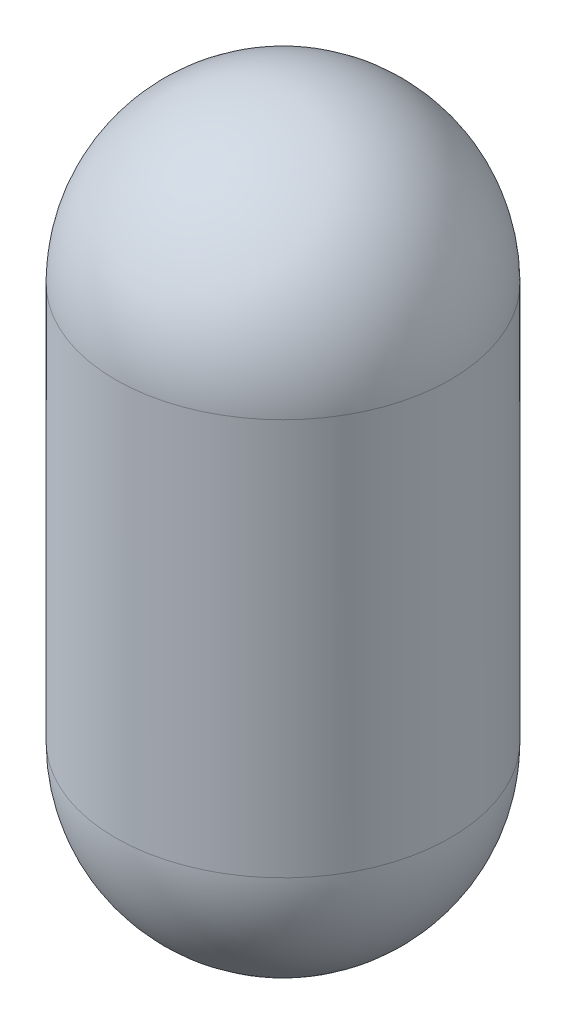
ISO-10303-21;
HEADER;
FILE_DESCRIPTION(('STEP AP214'),'2;1');
FILE_NAME('part.step','',(''),(''),'','','');
FILE_SCHEMA(('AUTOMOTIVE_DESIGN { 1 0 10303 214 1 1 1 1 }'));
ENDSEC;
DATA;
#1=APPLICATION_CONTEXT('core data for automotive mechanical design processes');
#2=APPLICATION_PROTOCOL_DEFINITION('international standard','automotive_design',2000,#1);
#3=PRODUCT_CONTEXT('',#1,'mechanical');
#4=PRODUCT('Part','Part','',(#3));
#5=PRODUCT_RELATED_PRODUCT_CATEGORY('part','',(#4));
#6=PRODUCT_DEFINITION_FORMATION('','',#4);
#7=PRODUCT_DEFINITION_CONTEXT('part definition',#1,'design');
#8=PRODUCT_DEFINITION('design','',#6,#7);
#9=PRODUCT_DEFINITION_SHAPE('','',#8);
#10=(LENGTH_UNIT() NAMED_UNIT(*) SI_UNIT(.MILLI.,.METRE.));
#11=(NAMED_UNIT(*) PLANE_ANGLE_UNIT() SI_UNIT($,.RADIAN.));
#12=(NAMED_UNIT(*) SI_UNIT($,.STERADIAN.) SOLID_ANGLE_UNIT());
#13=UNCERTAINTY_MEASURE_WITH_UNIT(LENGTH_MEASURE(1.E-05),#10,'distance_accuracy_value','');
#14=(GEOMETRIC_REPRESENTATION_CONTEXT(3) GLOBAL_UNCERTAINTY_ASSIGNED_CONTEXT((#13)) GLOBAL_UNIT_ASSIGNED_CONTEXT((#10,
#11,#12)) REPRESENTATION_CONTEXT('',''));
#15=CARTESIAN_POINT('',(0.,0.,0.));
#16=DIRECTION('',(0.,0.,1.));
#17=DIRECTION('',(1.,0.,0.));
#18=AXIS2_PLACEMENT_3D('',#15,#16,#17);
#19=CARTESIAN_POINT('',(0.,87.9475,0.));
#20=DIRECTION('',(0.,1.,0.));
#21=DIRECTION('',(1.,0.,0.));
#22=AXIS2_PLACEMENT_3D('',#19,#20,#21);
#23=SPHERICAL_SURFACE('',#22,74.295);
#24=CARTESIAN_POINT('',(0.,87.9475,0.));
#25=DIRECTION('',(0.,1.,0.));
#26=DIRECTION('',(0.,0.,1.));
#27=AXIS2_PLACEMENT_3D('',#24,#25,#26);
#28=CIRCLE('',#27,74.295);
#29=CARTESIAN_POINT('',(0.,87.9475,74.295));
#30=VERTEX_POINT('',#29);
#31=EDGE_CURVE('E10',#30,#30,#28,.T.);
#32=ORIENTED_EDGE('',*,*,#31,.T.);
#33=EDGE_LOOP('',(#32));
#34=FACE_BOUND('',#33,.T.);
#35=ADVANCED_FACE('F38',(#34),#23,.T.);
#36=CARTESIAN_POINT('',(0.,87.9475,0.));
#37=DIRECTION('',(0.,1.,0.));
#38=DIRECTION('',(0.,0.,1.));
#39=AXIS2_PLACEMENT_3D('',#36,#37,#38);
#40=CYLINDRICAL_SURFACE('',#39,74.295);
#41=CARTESIAN_POINT('',(0.,-87.9475,0.));
#42=DIRECTION('',(0.,1.,0.));
#43=DIRECTION('',(0.,0.,1.));
#44=AXIS2_PLACEMENT_3D('',#41,#42,#43);
#45=CIRCLE('',#44,74.295);
#46=CARTESIAN_POINT('',(0.,-87.9475,74.295));
#47=VERTEX_POINT('',#46);
#48=EDGE_CURVE('E46',#47,#47,#45,.T.);
#49=ORIENTED_EDGE('',*,*,#48,.T.);
#50=EDGE_LOOP('',(#49));
#51=FACE_BOUND('',#50,.T.);
#52=ORIENTED_EDGE('',*,*,#31,.F.);
#53=EDGE_LOOP('',(#52));
#54=FACE_BOUND('',#53,.T.);
#55=ADVANCED_FACE('F83',(#51,#54),#40,.T.);
#56=CARTESIAN_POINT('',(0.,-87.9475,0.));
#57=DIRECTION('',(0.,1.,0.));
#58=DIRECTION('',(-1.,0.,0.));
#59=AXIS2_PLACEMENT_3D('',#56,#57,#58);
#60=SPHERICAL_SURFACE('',#59,74.295);
#61=ORIENTED_EDGE('',*,*,#48,.F.);
#62=EDGE_LOOP('',(#61));
#63=FACE_BOUND('',#62,.T.);
#64=ADVANCED_FACE('F82',(#63),#60,.T.);
#65=CLOSED_SHELL('',(#35,#55,#64));
#66=CARTESIAN_POINT('',(0.,-87.9475,0.));
#67=DIRECTION('',(0.,1.,0.));
#68=DIRECTION('',(1.,0.,0.));
#69=AXIS2_PLACEMENT_3D('',#66,#67,#68);
#70=SPHERICAL_SURFACE('',#69,71.12);
#71=CARTESIAN_POINT('',(0.,-87.9475,0.));
#72=DIRECTION('',(0.,1.,0.));
#73=DIRECTION('',(0.,0.,1.));
#74=AXIS2_PLACEMENT_3D('',#71,#72,#73);
#75=CIRCLE('',#74,71.12);
#76=CARTESIAN_POINT('',(0.,-87.9475,71.12));
#77=VERTEX_POINT('',#76);
#78=EDGE_CURVE('E51',#77,#77,#75,.T.);
#79=ORIENTED_EDGE('',*,*,#78,.T.);
#80=EDGE_LOOP('',(#79));
#81=FACE_BOUND('',#80,.T.);
#82=ADVANCED_FACE('F73',(#81),#70,.F.);
#83=CARTESIAN_POINT('',(0.,87.9475,0.));
#84=DIRECTION('',(0.,1.,0.));
#85=DIRECTION('',(0.,0.,1.));
#86=AXIS2_PLACEMENT_3D('',#83,#84,#85);
#87=CYLINDRICAL_SURFACE('',#86,71.12);
#88=CARTESIAN_POINT('',(0.,87.9475,0.));
#89=DIRECTION('',(0.,1.,0.));
#90=DIRECTION('',(0.,0.,1.));
#91=AXIS2_PLACEMENT_3D('',#88,#89,#90);
#92=CIRCLE('',#91,71.12);
#93=CARTESIAN_POINT('',(0.,87.9475,71.12));
#94=VERTEX_POINT('',#93);
#95=EDGE_CURVE('E56',#94,#94,#92,.T.);
#96=ORIENTED_EDGE('',*,*,#95,.T.);
#97=EDGE_LOOP('',(#96));
#98=FACE_BOUND('',#97,.T.);
#99=ORIENTED_EDGE('',*,*,#78,.F.);
#100=EDGE_LOOP('',(#99));
#101=FACE_BOUND('',#100,.T.);
#102=ADVANCED_FACE('F63',(#98,#101),#87,.F.);
#103=CARTESIAN_POINT('',(0.,87.9475,0.));
#104=DIRECTION('',(0.,1.,0.));
#105=DIRECTION('',(-1.,0.,0.));
#106=AXIS2_PLACEMENT_3D('',#103,#104,#105);
#107=SPHERICAL_SURFACE('',#106,71.12);
#108=ORIENTED_EDGE('',*,*,#95,.F.);
#109=EDGE_LOOP('',(#108));
#110=FACE_BOUND('',#109,.T.);
#111=ADVANCED_FACE('F66',(#110),#107,.F.);
#112=CLOSED_SHELL('',(#82,#102,#111));
#113=ORIENTED_CLOSED_SHELL('',*,#112,.T.);
#114=BREP_WITH_VOIDS('B2',#65,(#113));
#115=ADVANCED_BREP_SHAPE_REPRESENTATION('',(#18,#114),#14);
#116=SHAPE_DEFINITION_REPRESENTATION(#9,#115);
ENDSEC;
END-ISO-10303-21;
